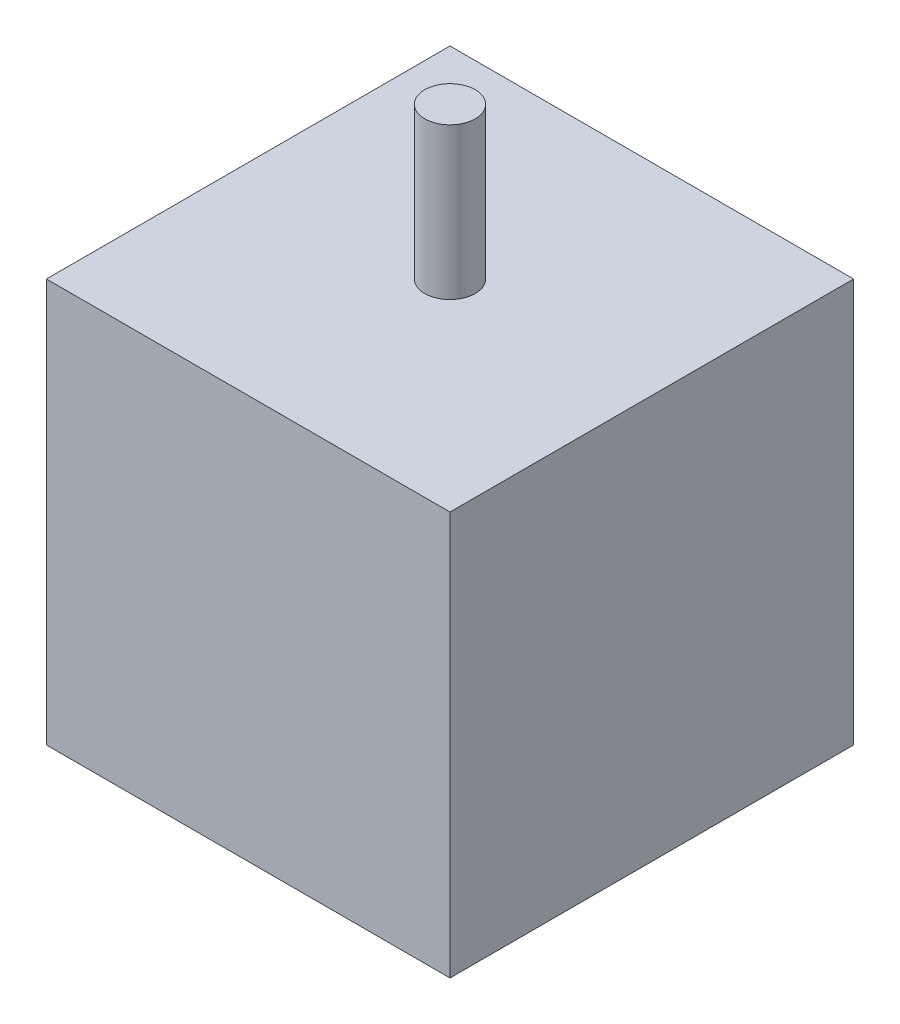
ISO-10303-21;
HEADER;
FILE_DESCRIPTION(('STEP AP214'),'2;1');
FILE_NAME('part.step','',(''),(''),'','','');
FILE_SCHEMA(('AUTOMOTIVE_DESIGN { 1 0 10303 214 1 1 1 1 }'));
ENDSEC;
DATA;
#1=APPLICATION_CONTEXT('core data for automotive mechanical design processes');
#2=APPLICATION_PROTOCOL_DEFINITION('international standard','automotive_design',2000,#1);
#3=PRODUCT_CONTEXT('',#1,'mechanical');
#4=PRODUCT('Part','Part','',(#3));
#5=PRODUCT_RELATED_PRODUCT_CATEGORY('part','',(#4));
#6=PRODUCT_DEFINITION_FORMATION('','',#4);
#7=PRODUCT_DEFINITION_CONTEXT('part definition',#1,'design');
#8=PRODUCT_DEFINITION('design','',#6,#7);
#9=PRODUCT_DEFINITION_SHAPE('','',#8);
#10=(LENGTH_UNIT() NAMED_UNIT(*) SI_UNIT(.MILLI.,.METRE.));
#11=(NAMED_UNIT(*) PLANE_ANGLE_UNIT() SI_UNIT($,.RADIAN.));
#12=(NAMED_UNIT(*) SI_UNIT($,.STERADIAN.) SOLID_ANGLE_UNIT());
#13=UNCERTAINTY_MEASURE_WITH_UNIT(LENGTH_MEASURE(1.E-05),#10,'distance_accuracy_value','');
#14=(GEOMETRIC_REPRESENTATION_CONTEXT(3) GLOBAL_UNCERTAINTY_ASSIGNED_CONTEXT((#13)) GLOBAL_UNIT_ASSIGNED_CONTEXT((#10,
#11,#12)) REPRESENTATION_CONTEXT('',''));
#15=CARTESIAN_POINT('',(0.,0.,0.));
#16=DIRECTION('',(0.,0.,1.));
#17=DIRECTION('',(1.,0.,0.));
#18=AXIS2_PLACEMENT_3D('',#15,#16,#17);
#19=CARTESIAN_POINT('',(0.,101.6,0.));
#20=DIRECTION('',(1.,0.,0.));
#21=DIRECTION('',(0.,0.,-1.));
#22=AXIS2_PLACEMENT_3D('',#19,#20,#21);
#23=PLANE('',#22);
#24=DIRECTION('',(0.,0.,1.));
#25=VECTOR('',#24,1.);
#26=CARTESIAN_POINT('',(0.,0.,0.));
#27=LINE('',#26,#25);
#28=CARTESIAN_POINT('',(0.,0.,-101.6));
#29=VERTEX_POINT('',#28);
#30=CARTESIAN_POINT('',(0.,0.,0.));
#31=VERTEX_POINT('',#30);
#32=EDGE_CURVE('E114',#29,#31,#27,.T.);
#33=ORIENTED_EDGE('',*,*,#32,.T.);
#34=DIRECTION('',(0.,-1.,0.));
#35=VECTOR('',#34,1.);
#36=CARTESIAN_POINT('',(0.,101.6,0.));
#37=LINE('',#36,#35);
#38=CARTESIAN_POINT('',(0.,101.6,0.));
#39=VERTEX_POINT('',#38);
#40=EDGE_CURVE('E52',#39,#31,#37,.T.);
#41=ORIENTED_EDGE('',*,*,#40,.F.);
#42=DIRECTION('',(0.,0.,1.));
#43=VECTOR('',#42,1.);
#44=CARTESIAN_POINT('',(0.,101.6,0.));
#45=LINE('',#44,#43);
#46=CARTESIAN_POINT('',(0.,101.6,-101.6));
#47=VERTEX_POINT('',#46);
#48=EDGE_CURVE('E96',#47,#39,#45,.T.);
#49=ORIENTED_EDGE('',*,*,#48,.F.);
#50=DIRECTION('',(0.,-1.,0.));
#51=VECTOR('',#50,1.);
#52=CARTESIAN_POINT('',(0.,101.6,-101.6));
#53=LINE('',#52,#51);
#54=EDGE_CURVE('E110',#47,#29,#53,.T.);
#55=ORIENTED_EDGE('',*,*,#54,.T.);
#56=EDGE_LOOP('',(#33,#41,#49,#55));
#57=FACE_BOUND('',#56,.T.);
#58=ADVANCED_FACE('F43',(#57),#23,.F.);
#59=CARTESIAN_POINT('',(0.,101.6,0.));
#60=DIRECTION('',(0.,0.,-1.));
#61=DIRECTION('',(-1.,0.,0.));
#62=AXIS2_PLACEMENT_3D('',#59,#60,#61);
#63=PLANE('',#62);
#64=DIRECTION('',(1.,0.,0.));
#65=VECTOR('',#64,1.);
#66=CARTESIAN_POINT('',(0.,0.,0.));
#67=LINE('',#66,#65);
#68=CARTESIAN_POINT('',(101.6,0.,0.));
#69=VERTEX_POINT('',#68);
#70=EDGE_CURVE('E102',#31,#69,#67,.T.);
#71=ORIENTED_EDGE('',*,*,#70,.T.);
#72=DIRECTION('',(0.,-1.,0.));
#73=VECTOR('',#72,1.);
#74=CARTESIAN_POINT('',(101.6,101.6,0.));
#75=LINE('',#74,#73);
#76=CARTESIAN_POINT('',(101.6,101.6,0.));
#77=VERTEX_POINT('',#76);
#78=EDGE_CURVE('E100',#77,#69,#75,.T.);
#79=ORIENTED_EDGE('',*,*,#78,.F.);
#80=DIRECTION('',(1.,0.,0.));
#81=VECTOR('',#80,1.);
#82=CARTESIAN_POINT('',(0.,101.6,0.));
#83=LINE('',#82,#81);
#84=EDGE_CURVE('E91',#39,#77,#83,.T.);
#85=ORIENTED_EDGE('',*,*,#84,.F.);
#86=ORIENTED_EDGE('',*,*,#40,.T.);
#87=EDGE_LOOP('',(#71,#79,#85,#86));
#88=FACE_BOUND('',#87,.T.);
#89=ADVANCED_FACE('F101',(#88),#63,.F.);
#90=CARTESIAN_POINT('',(101.6,101.6,0.));
#91=DIRECTION('',(-1.,0.,0.));
#92=DIRECTION('',(0.,0.,1.));
#93=AXIS2_PLACEMENT_3D('',#90,#91,#92);
#94=PLANE('',#93);
#95=DIRECTION('',(0.,0.,-1.));
#96=VECTOR('',#95,1.);
#97=CARTESIAN_POINT('',(101.6,0.,0.));
#98=LINE('',#97,#96);
#99=CARTESIAN_POINT('',(101.6,0.,-101.6));
#100=VERTEX_POINT('',#99);
#101=EDGE_CURVE('E77',#69,#100,#98,.T.);
#102=ORIENTED_EDGE('',*,*,#101,.T.);
#103=DIRECTION('',(0.,-1.,0.));
#104=VECTOR('',#103,1.);
#105=CARTESIAN_POINT('',(101.6,101.6,-101.6));
#106=LINE('',#105,#104);
#107=CARTESIAN_POINT('',(101.6,101.6,-101.6));
#108=VERTEX_POINT('',#107);
#109=EDGE_CURVE('E104',#108,#100,#106,.T.);
#110=ORIENTED_EDGE('',*,*,#109,.F.);
#111=DIRECTION('',(0.,0.,-1.));
#112=VECTOR('',#111,1.);
#113=CARTESIAN_POINT('',(101.6,101.6,0.));
#114=LINE('',#113,#112);
#115=EDGE_CURVE('E94',#77,#108,#114,.T.);
#116=ORIENTED_EDGE('',*,*,#115,.F.);
#117=ORIENTED_EDGE('',*,*,#78,.T.);
#118=EDGE_LOOP('',(#102,#110,#116,#117));
#119=FACE_BOUND('',#118,.T.);
#120=ADVANCED_FACE('F106',(#119),#94,.F.);
#121=CARTESIAN_POINT('',(0.,101.6,-101.6));
#122=DIRECTION('',(0.,0.,1.));
#123=DIRECTION('',(1.,0.,0.));
#124=AXIS2_PLACEMENT_3D('',#121,#122,#123);
#125=PLANE('',#124);
#126=DIRECTION('',(-1.,0.,0.));
#127=VECTOR('',#126,1.);
#128=CARTESIAN_POINT('',(0.,0.,-101.6));
#129=LINE('',#128,#127);
#130=EDGE_CURVE('E83',#100,#29,#129,.T.);
#131=ORIENTED_EDGE('',*,*,#130,.T.);
#132=ORIENTED_EDGE('',*,*,#54,.F.);
#133=DIRECTION('',(-1.,0.,0.));
#134=VECTOR('',#133,1.);
#135=CARTESIAN_POINT('',(0.,101.6,-101.6));
#136=LINE('',#135,#134);
#137=EDGE_CURVE('E60',#108,#47,#136,.T.);
#138=ORIENTED_EDGE('',*,*,#137,.F.);
#139=ORIENTED_EDGE('',*,*,#109,.T.);
#140=EDGE_LOOP('',(#131,#132,#138,#139));
#141=FACE_BOUND('',#140,.T.);
#142=ADVANCED_FACE('F143',(#141),#125,.F.);
#143=CARTESIAN_POINT('',(0.,101.6,0.));
#144=DIRECTION('',(0.,-1.,0.));
#145=DIRECTION('',(0.,0.,-1.));
#146=AXIS2_PLACEMENT_3D('',#143,#144,#145);
#147=PLANE('',#146);
#148=CARTESIAN_POINT('',(50.8,101.6,-50.8));
#149=DIRECTION('',(0.,-1.,0.));
#150=DIRECTION('',(0.,0.,-1.));
#151=AXIS2_PLACEMENT_3D('',#148,#149,#150);
#152=CIRCLE('',#151,6.35);
#153=CARTESIAN_POINT('',(50.8,101.6,-57.15));
#154=VERTEX_POINT('',#153);
#155=EDGE_CURVE('E11',#154,#154,#152,.F.);
#156=ORIENTED_EDGE('',*,*,#155,.F.);
#157=EDGE_LOOP('',(#156));
#158=FACE_BOUND('',#157,.T.);
#159=ORIENTED_EDGE('',*,*,#48,.T.);
#160=ORIENTED_EDGE('',*,*,#84,.T.);
#161=ORIENTED_EDGE('',*,*,#115,.T.);
#162=ORIENTED_EDGE('',*,*,#137,.T.);
#163=EDGE_LOOP('',(#159,#160,#161,#162));
#164=FACE_BOUND('',#163,.T.);
#165=ADVANCED_FACE('F92',(#158,#164),#147,.F.);
#166=CARTESIAN_POINT('',(0.,0.,0.));
#167=DIRECTION('',(0.,-1.,0.));
#168=DIRECTION('',(0.,0.,-1.));
#169=AXIS2_PLACEMENT_3D('',#166,#167,#168);
#170=PLANE('',#169);
#171=ORIENTED_EDGE('',*,*,#32,.F.);
#172=ORIENTED_EDGE('',*,*,#130,.F.);
#173=ORIENTED_EDGE('',*,*,#101,.F.);
#174=ORIENTED_EDGE('',*,*,#70,.F.);
#175=EDGE_LOOP('',(#171,#172,#173,#174));
#176=FACE_BOUND('',#175,.T.);
#177=ADVANCED_FACE('F132',(#176),#170,.T.);
#178=CARTESIAN_POINT('',(50.8,139.7,-50.8));
#179=DIRECTION('',(0.,-1.,0.));
#180=DIRECTION('',(0.,0.,-1.));
#181=AXIS2_PLACEMENT_3D('',#178,#179,#180);
#182=CYLINDRICAL_SURFACE('',#181,6.35);
#183=CARTESIAN_POINT('',(50.8,139.7,-50.8));
#184=DIRECTION('',(0.,1.,0.));
#185=DIRECTION('',(0.,0.,1.));
#186=AXIS2_PLACEMENT_3D('',#183,#184,#185);
#187=CIRCLE('',#186,6.35);
#188=CARTESIAN_POINT('',(50.8,139.7,-57.15));
#189=VERTEX_POINT('',#188);
#190=EDGE_CURVE('E118',#189,#189,#187,.T.);
#191=CARTESIAN_POINT('',(50.8,139.7,-57.15));
#192=CARTESIAN_POINT('',(50.8,139.303125,-57.15));
#193=CARTESIAN_POINT('',(50.8,138.90625,-57.15));
#194=CARTESIAN_POINT('',(50.8,138.1125,-57.15));
#195=CARTESIAN_POINT('',(50.8,137.715625,-57.15));
#196=CARTESIAN_POINT('',(50.8,136.921875,-57.15));
#197=CARTESIAN_POINT('',(50.8,136.525,-57.15));
#198=CARTESIAN_POINT('',(50.8,135.73125,-57.15));
#199=CARTESIAN_POINT('',(50.8,135.334375,-57.15));
#200=CARTESIAN_POINT('',(50.8,134.540625,-57.15));
#201=CARTESIAN_POINT('',(50.8,134.14375,-57.15));
#202=CARTESIAN_POINT('',(50.8,133.35,-57.15));
#203=CARTESIAN_POINT('',(50.8,132.953125,-57.15));
#204=CARTESIAN_POINT('',(50.8,132.159375,-57.15));
#205=CARTESIAN_POINT('',(50.8,131.7625,-57.15));
#206=CARTESIAN_POINT('',(50.8,130.96875,-57.15));
#207=CARTESIAN_POINT('',(50.8,130.571875,-57.15));
#208=CARTESIAN_POINT('',(50.8,129.778125,-57.15));
#209=CARTESIAN_POINT('',(50.8,129.38125,-57.15));
#210=CARTESIAN_POINT('',(50.8,128.5875,-57.15));
#211=CARTESIAN_POINT('',(50.8,128.190625,-57.15));
#212=CARTESIAN_POINT('',(50.8,127.396875,-57.15));
#213=CARTESIAN_POINT('',(50.8,127.,-57.15));
#214=CARTESIAN_POINT('',(50.8,126.20625,-57.15));
#215=CARTESIAN_POINT('',(50.8,125.809375,-57.15));
#216=CARTESIAN_POINT('',(50.8,125.015625,-57.15));
#217=CARTESIAN_POINT('',(50.8,124.61875,-57.15));
#218=CARTESIAN_POINT('',(50.8,123.825,-57.15));
#219=CARTESIAN_POINT('',(50.8,123.428125,-57.15));
#220=CARTESIAN_POINT('',(50.8,122.634375,-57.15));
#221=CARTESIAN_POINT('',(50.8,122.2375,-57.15));
#222=CARTESIAN_POINT('',(50.8,121.44375,-57.15));
#223=CARTESIAN_POINT('',(50.8,121.046875,-57.15));
#224=CARTESIAN_POINT('',(50.8,120.253125,-57.15));
#225=CARTESIAN_POINT('',(50.8,119.85625,-57.15));
#226=CARTESIAN_POINT('',(50.8,119.0625,-57.15));
#227=CARTESIAN_POINT('',(50.8,118.665625,-57.15));
#228=CARTESIAN_POINT('',(50.8,117.871875,-57.15));
#229=CARTESIAN_POINT('',(50.8,117.475,-57.15));
#230=CARTESIAN_POINT('',(50.8,116.68125,-57.15));
#231=CARTESIAN_POINT('',(50.8,116.284375,-57.15));
#232=CARTESIAN_POINT('',(50.8,115.490625,-57.15));
#233=CARTESIAN_POINT('',(50.8,115.09375,-57.15));
#234=CARTESIAN_POINT('',(50.8,114.3,-57.15));
#235=CARTESIAN_POINT('',(50.8,113.903125,-57.15));
#236=CARTESIAN_POINT('',(50.8,113.109375,-57.15));
#237=CARTESIAN_POINT('',(50.8,112.7125,-57.15));
#238=CARTESIAN_POINT('',(50.8,111.91875,-57.15));
#239=CARTESIAN_POINT('',(50.8,111.521875,-57.15));
#240=CARTESIAN_POINT('',(50.8,110.728125,-57.15));
#241=CARTESIAN_POINT('',(50.8,110.33125,-57.15));
#242=CARTESIAN_POINT('',(50.8,109.5375,-57.15));
#243=CARTESIAN_POINT('',(50.8,109.140625,-57.15));
#244=CARTESIAN_POINT('',(50.8,108.346875,-57.15));
#245=CARTESIAN_POINT('',(50.8,107.95,-57.15));
#246=CARTESIAN_POINT('',(50.8,107.15625,-57.15));
#247=CARTESIAN_POINT('',(50.8,106.759375,-57.15));
#248=CARTESIAN_POINT('',(50.8,105.965625,-57.15));
#249=CARTESIAN_POINT('',(50.8,105.56875,-57.15));
#250=CARTESIAN_POINT('',(50.8,104.775,-57.15));
#251=CARTESIAN_POINT('',(50.8,104.378125,-57.15));
#252=CARTESIAN_POINT('',(50.8,103.584375,-57.15));
#253=CARTESIAN_POINT('',(50.8,103.1875,-57.15));
#254=CARTESIAN_POINT('',(50.8,102.39375,-57.15));
#255=CARTESIAN_POINT('',(50.8,101.996875,-57.15));
#256=CARTESIAN_POINT('',(50.8,101.6,-57.15));
#257=B_SPLINE_CURVE_WITH_KNOTS('',3,(#191,#192,#193,#194,#195,#196,#197,#198,#199,#200,#201,
#202,#203,#204,#205,#206,#207,#208,#209,#210,#211,#212,#213,#214,#215,#216,#217,#218,#219,#220,
#221,#222,#223,#224,#225,#226,#227,#228,#229,#230,#231,#232,#233,#234,#235,#236,#237,#238,#239,
#240,#241,#242,#243,#244,#245,#246,#247,#248,#249,#250,#251,#252,#253,#254,#255,#256),
.UNSPECIFIED.,.F.,.F.,(4,2,2,2,2,2,2,2,2,2,2,2,2,2,2,2,2,2,2,2,2,2,2,2,2,2,2,2,2,2,2,2,4),(0.,
1.190625,2.38125,3.571875,4.7625,5.953125,7.14375,8.334375,9.52500000000001,10.715625,11.90625,
13.096875,14.2875,15.478125,16.66875,17.859375,19.05,20.240625,21.43125,22.621875,23.8125,
25.003125,26.19375,27.384375,28.575,29.765625,30.95625,32.146875,33.3375,34.528125,35.71875,
36.909375,38.1),.UNSPECIFIED.);
#258=EDGE_CURVE('BSEAM134',#189,#154,#257,.T.);
#259=ORIENTED_EDGE('',*,*,#190,.F.);
#260=ORIENTED_EDGE('',*,*,#155,.T.);
#261=ORIENTED_EDGE('',*,*,#258,.T.);
#262=ORIENTED_EDGE('',*,*,#258,.F.);
#263=EDGE_LOOP('',(#259,#261,#260,#262));
#264=FACE_BOUND('',#263,.T.);
#265=ADVANCED_FACE('F134',(#264),#182,.T.);
#266=CARTESIAN_POINT('',(50.8,139.7,-50.8));
#267=DIRECTION('',(0.,1.,0.));
#268=DIRECTION('',(0.,0.,1.));
#269=AXIS2_PLACEMENT_3D('',#266,#267,#268);
#270=PLANE('',#269);
#271=ORIENTED_EDGE('',*,*,#190,.T.);
#272=EDGE_LOOP('',(#271));
#273=FACE_BOUND('',#272,.T.);
#274=ADVANCED_FACE('F140',(#273),#270,.T.);
#275=CLOSED_SHELL('',(#58,#89,#120,#142,#165,#177,#265,#274));
#276=MANIFOLD_SOLID_BREP('B2',#275);
#277=ADVANCED_BREP_SHAPE_REPRESENTATION('',(#18,#276),#14);
#278=SHAPE_DEFINITION_REPRESENTATION(#9,#277);
ENDSEC;
END-ISO-10303-21;
